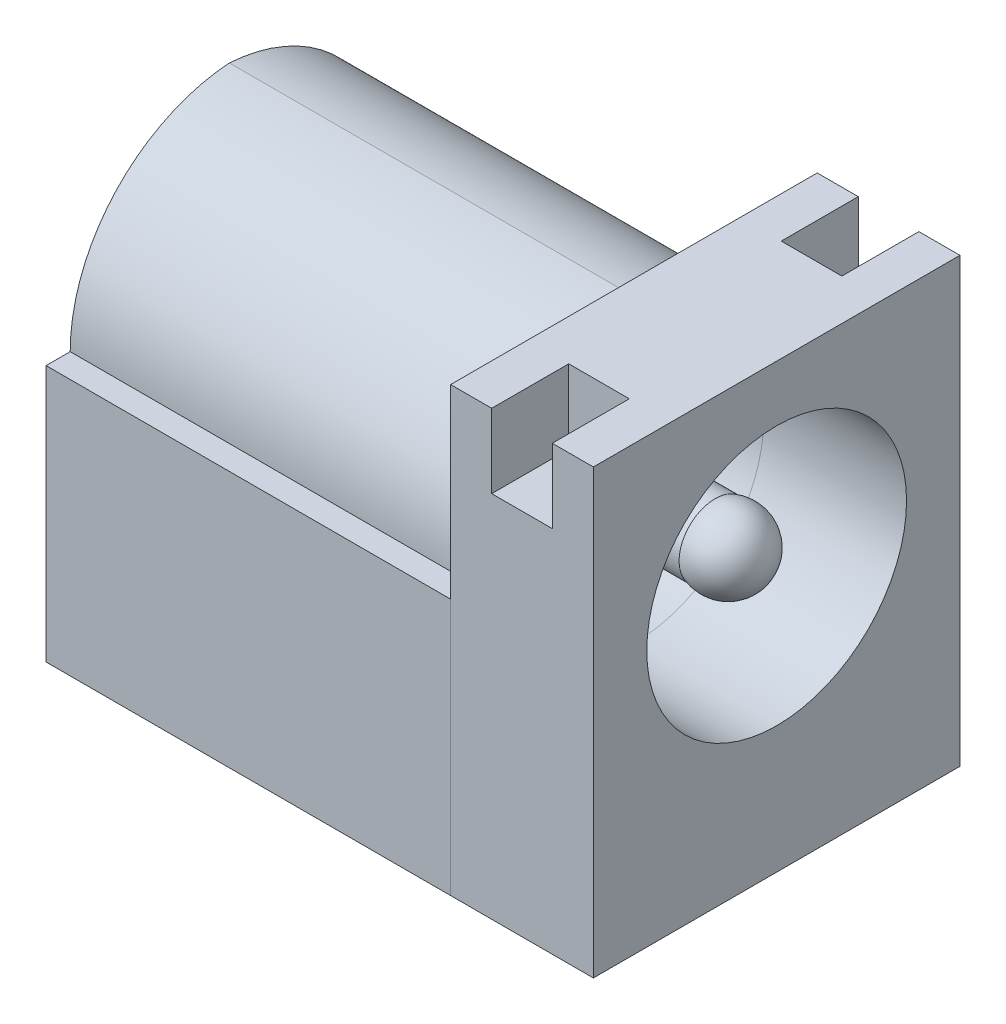
ISO-10303-21;
HEADER;
FILE_DESCRIPTION(('STEP AP214'),'2;1');
FILE_NAME('part.step','',(''),(''),'','','');
FILE_SCHEMA(('AUTOMOTIVE_DESIGN { 1 0 10303 214 1 1 1 1 }'));
ENDSEC;
DATA;
#1=APPLICATION_CONTEXT('core data for automotive mechanical design processes');
#2=APPLICATION_PROTOCOL_DEFINITION('international standard','automotive_design',2000,#1);
#3=PRODUCT_CONTEXT('',#1,'mechanical');
#4=PRODUCT('Part','Part','',(#3));
#5=PRODUCT_RELATED_PRODUCT_CATEGORY('part','',(#4));
#6=PRODUCT_DEFINITION_FORMATION('','',#4);
#7=PRODUCT_DEFINITION_CONTEXT('part definition',#1,'design');
#8=PRODUCT_DEFINITION('design','',#6,#7);
#9=PRODUCT_DEFINITION_SHAPE('','',#8);
#10=(LENGTH_UNIT() NAMED_UNIT(*) SI_UNIT(.MILLI.,.METRE.));
#11=(NAMED_UNIT(*) PLANE_ANGLE_UNIT() SI_UNIT($,.RADIAN.));
#12=(NAMED_UNIT(*) SI_UNIT($,.STERADIAN.) SOLID_ANGLE_UNIT());
#13=UNCERTAINTY_MEASURE_WITH_UNIT(LENGTH_MEASURE(1.E-05),#10,'distance_accuracy_value','');
#14=(GEOMETRIC_REPRESENTATION_CONTEXT(3) GLOBAL_UNCERTAINTY_ASSIGNED_CONTEXT((#13)) GLOBAL_UNIT_ASSIGNED_CONTEXT((#10,
#11,#12)) REPRESENTATION_CONTEXT('',''));
#15=CARTESIAN_POINT('',(0.,0.,0.));
#16=DIRECTION('',(0.,0.,1.));
#17=DIRECTION('',(1.,0.,0.));
#18=AXIS2_PLACEMENT_3D('',#15,#16,#17);
#19=CARTESIAN_POINT('',(-1.524,0.876299999999998,0.));
#20=DIRECTION('',(-1.,0.,0.));
#21=DIRECTION('',(0.,0.,1.));
#22=AXIS2_PLACEMENT_3D('',#19,#20,#21);
#23=CYLINDRICAL_SURFACE('',#22,0.889);
#24=CARTESIAN_POINT('',(-1.524,0.876299999999998,0.));
#25=DIRECTION('',(1.,0.,0.));
#26=DIRECTION('',(0.,0.,-1.));
#27=AXIS2_PLACEMENT_3D('',#24,#25,#26);
#28=CIRCLE('',#27,0.889);
#29=CARTESIAN_POINT('',(-1.524,0.876299999999998,-0.889));
#30=VERTEX_POINT('',#29);
#31=EDGE_CURVE('E11',#30,#30,#28,.T.);
#32=ORIENTED_EDGE('',*,*,#31,.F.);
#33=EDGE_LOOP('',(#32));
#34=FACE_BOUND('',#33,.T.);
#35=CARTESIAN_POINT('',(-9.0678,0.876299999999998,0.));
#36=DIRECTION('',(1.,0.,0.));
#37=DIRECTION('',(0.,0.,-1.));
#38=AXIS2_PLACEMENT_3D('',#35,#36,#37);
#39=CIRCLE('',#38,0.889);
#40=CARTESIAN_POINT('',(-9.0678,0.876299999999998,-0.889));
#41=VERTEX_POINT('',#40);
#42=EDGE_CURVE('E48',#41,#41,#39,.T.);
#43=ORIENTED_EDGE('',*,*,#42,.T.);
#44=EDGE_LOOP('',(#43));
#45=FACE_BOUND('',#44,.T.);
#46=ADVANCED_FACE('F41',(#34,#45),#23,.T.);
#47=CARTESIAN_POINT('',(-1.20015,0.876299999999998,0.));
#48=DIRECTION('',(0.,0.,1.));
#49=DIRECTION('',(1.,0.,0.));
#50=AXIS2_PLACEMENT_3D('',#47,#48,#49);
#51=SPHERICAL_SURFACE('',#50,0.94615);
#52=CARTESIAN_POINT('',(-1.20015,0.876299999999998,0.));
#53=DIRECTION('',(1.,0.,0.));
#54=DIRECTION('',(0.,0.,-1.));
#55=AXIS2_PLACEMENT_3D('',#52,#53,#54);
#56=SPHERICAL_SURFACE('',#55,0.94615);
#57=ORIENTED_EDGE('',*,*,#31,.T.);
#58=EDGE_LOOP('',(#57));
#59=FACE_BOUND('',#58,.T.);
#60=ADVANCED_FACE('F43',(#59),#56,.T.);
#61=CARTESIAN_POINT('',(-9.0678,0.876299999999998,0.));
#62=DIRECTION('',(1.,0.,0.));
#63=DIRECTION('',(0.,0.,-1.));
#64=AXIS2_PLACEMENT_3D('',#61,#62,#63);
#65=PLANE('',#64);
#66=ORIENTED_EDGE('',*,*,#42,.F.);
#67=EDGE_LOOP('',(#66));
#68=FACE_BOUND('',#67,.T.);
#69=ADVANCED_FACE('F55',(#68),#65,.F.);
#70=CLOSED_SHELL('',(#46,#60,#69));
#71=MANIFOLD_SOLID_BREP('B2',#70);
#72=CARTESIAN_POINT('',(-13.5382,-5.4737,-4.53389999999999));
#73=DIRECTION('',(0.,0.,1.));
#74=DIRECTION('',(0.,-1.,0.));
#75=AXIS2_PLACEMENT_3D('',#72,#73,#74);
#76=PLANE('',#75);
#77=DIRECTION('',(0.,-1.,0.));
#78=VECTOR('',#77,1.);
#79=CARTESIAN_POINT('',(-3.5306,-5.4737,-4.53389999999999));
#80=LINE('',#79,#78);
#81=CARTESIAN_POINT('',(-3.5306,0.876299999999998,-4.53389999999999));
#82=VERTEX_POINT('',#81);
#83=CARTESIAN_POINT('',(-3.5306,-5.4737,-4.53389999999999));
#84=VERTEX_POINT('',#83);
#85=EDGE_CURVE('E181',#82,#84,#80,.T.);
#86=ORIENTED_EDGE('',*,*,#85,.T.);
#87=DIRECTION('',(1.,0.,0.));
#88=VECTOR('',#87,1.);
#89=CARTESIAN_POINT('',(-13.5382,-5.4737,-4.53389999999999));
#90=LINE('',#89,#88);
#91=CARTESIAN_POINT('',(-13.5382,-5.4737,-4.53389999999999));
#92=VERTEX_POINT('',#91);
#93=EDGE_CURVE('E39',#92,#84,#90,.T.);
#94=ORIENTED_EDGE('',*,*,#93,.F.);
#95=DIRECTION('',(0.,-1.,0.));
#96=VECTOR('',#95,1.);
#97=CARTESIAN_POINT('',(-13.5382,-5.4737,-4.53389999999999));
#98=LINE('',#97,#96);
#99=CARTESIAN_POINT('',(-13.5382,0.876299999999998,-4.53389999999999));
#100=VERTEX_POINT('',#99);
#101=EDGE_CURVE('E193',#100,#92,#98,.T.);
#102=ORIENTED_EDGE('',*,*,#101,.F.);
#103=DIRECTION('',(1.,0.,0.));
#104=VECTOR('',#103,1.);
#105=CARTESIAN_POINT('',(-13.5382,0.876299999999998,-4.53389999999999));
#106=LINE('',#105,#104);
#107=EDGE_CURVE('E177',#100,#82,#106,.T.);
#108=ORIENTED_EDGE('',*,*,#107,.T.);
#109=EDGE_LOOP('',(#86,#94,#102,#108));
#110=FACE_BOUND('',#109,.T.);
#111=ADVANCED_FACE('F90',(#110),#76,.F.);
#112=CARTESIAN_POINT('',(-13.5382,-5.4737,-4.53389999999999));
#113=DIRECTION('',(0.,1.,0.));
#114=DIRECTION('',(0.,0.,1.));
#115=AXIS2_PLACEMENT_3D('',#112,#113,#114);
#116=PLANE('',#115);
#117=DIRECTION('',(0.,0.,1.));
#118=VECTOR('',#117,1.);
#119=CARTESIAN_POINT('',(-3.5306,-5.4737,-4.53389999999999));
#120=LINE('',#119,#118);
#121=CARTESIAN_POINT('',(-3.5306,-5.4737,4.53390000000001));
#122=VERTEX_POINT('',#121);
#123=EDGE_CURVE('E184',#84,#122,#120,.T.);
#124=ORIENTED_EDGE('',*,*,#123,.T.);
#125=DIRECTION('',(1.,0.,0.));
#126=VECTOR('',#125,1.);
#127=CARTESIAN_POINT('',(-13.5382,-5.4737,4.53390000000001));
#128=LINE('',#127,#126);
#129=CARTESIAN_POINT('',(-13.5382,-5.4737,4.53390000000001));
#130=VERTEX_POINT('',#129);
#131=EDGE_CURVE('E99',#130,#122,#128,.T.);
#132=ORIENTED_EDGE('',*,*,#131,.F.);
#133=DIRECTION('',(0.,0.,1.));
#134=VECTOR('',#133,1.);
#135=CARTESIAN_POINT('',(-13.5382,-5.4737,-4.53389999999999));
#136=LINE('',#135,#134);
#137=EDGE_CURVE('E147',#92,#130,#136,.T.);
#138=ORIENTED_EDGE('',*,*,#137,.F.);
#139=ORIENTED_EDGE('',*,*,#93,.T.);
#140=EDGE_LOOP('',(#124,#132,#138,#139));
#141=FACE_BOUND('',#140,.T.);
#142=ADVANCED_FACE('F239',(#141),#116,.F.);
#143=CARTESIAN_POINT('',(-13.5382,-5.4737,4.53390000000001));
#144=DIRECTION('',(0.,0.,-1.));
#145=DIRECTION('',(-1.,0.,0.));
#146=AXIS2_PLACEMENT_3D('',#143,#144,#145);
#147=PLANE('',#146);
#148=DIRECTION('',(0.,1.,0.));
#149=VECTOR('',#148,1.);
#150=CARTESIAN_POINT('',(-3.5306,-5.4737,4.53390000000001));
#151=LINE('',#150,#149);
#152=CARTESIAN_POINT('',(-3.5306,0.876299999999999,4.53390000000001));
#153=VERTEX_POINT('',#152);
#154=EDGE_CURVE('E186',#122,#153,#151,.T.);
#155=ORIENTED_EDGE('',*,*,#154,.T.);
#156=DIRECTION('',(1.,0.,0.));
#157=VECTOR('',#156,1.);
#158=CARTESIAN_POINT('',(-13.5382,0.876299999999999,4.53390000000001));
#159=LINE('',#158,#157);
#160=CARTESIAN_POINT('',(-13.5382,0.876299999999999,4.53390000000001));
#161=VERTEX_POINT('',#160);
#162=EDGE_CURVE('E197',#161,#153,#159,.T.);
#163=ORIENTED_EDGE('',*,*,#162,.F.);
#164=DIRECTION('',(0.,1.,0.));
#165=VECTOR('',#164,1.);
#166=CARTESIAN_POINT('',(-13.5382,-5.4737,4.53390000000001));
#167=LINE('',#166,#165);
#168=EDGE_CURVE('E206',#130,#161,#167,.T.);
#169=ORIENTED_EDGE('',*,*,#168,.F.);
#170=ORIENTED_EDGE('',*,*,#131,.T.);
#171=EDGE_LOOP('',(#155,#163,#169,#170));
#172=FACE_BOUND('',#171,.T.);
#173=ADVANCED_FACE('F204',(#172),#147,.F.);
#174=CARTESIAN_POINT('',(-13.5382,0.876299999999998,3.937));
#175=DIRECTION('',(0.,-1.,0.));
#176=DIRECTION('',(0.,0.,-1.));
#177=AXIS2_PLACEMENT_3D('',#174,#175,#176);
#178=PLANE('',#177);
#179=DIRECTION('',(0.,0.,-1.));
#180=VECTOR('',#179,1.);
#181=CARTESIAN_POINT('',(-3.5306,0.876299999999998,3.937));
#182=LINE('',#181,#180);
#183=CARTESIAN_POINT('',(-3.5306,0.876299999999998,3.937));
#184=VERTEX_POINT('',#183);
#185=EDGE_CURVE('E188',#153,#184,#182,.T.);
#186=ORIENTED_EDGE('',*,*,#185,.T.);
#187=DIRECTION('',(1.,0.,0.));
#188=VECTOR('',#187,1.);
#189=CARTESIAN_POINT('',(-13.5382,0.876299999999998,3.937));
#190=LINE('',#189,#188);
#191=CARTESIAN_POINT('',(-13.5382,0.876299999999998,3.937));
#192=VERTEX_POINT('',#191);
#193=EDGE_CURVE('E172',#192,#184,#190,.T.);
#194=ORIENTED_EDGE('',*,*,#193,.F.);
#195=DIRECTION('',(0.,0.,-1.));
#196=VECTOR('',#195,1.);
#197=CARTESIAN_POINT('',(-13.5382,0.876299999999998,3.937));
#198=LINE('',#197,#196);
#199=EDGE_CURVE('E163',#161,#192,#198,.T.);
#200=ORIENTED_EDGE('',*,*,#199,.F.);
#201=ORIENTED_EDGE('',*,*,#162,.T.);
#202=EDGE_LOOP('',(#186,#194,#200,#201));
#203=FACE_BOUND('',#202,.T.);
#204=ADVANCED_FACE('F212',(#203),#178,.F.);
#205=CARTESIAN_POINT('',(-13.5382,0.876299999999994,-0.289314193548392));
#206=DIRECTION('',(1.,0.,0.));
#207=DIRECTION('',(0.,0.,-1.));
#208=AXIS2_PLACEMENT_3D('',#205,#206,#207);
#209=CYLINDRICAL_SURFACE('',#208,4.22631419354839);
#210=CARTESIAN_POINT('',(-3.5306,0.876299999999994,-0.289314193548392));
#211=DIRECTION('',(-1.,0.,0.));
#212=DIRECTION('',(0.,0.,1.));
#213=AXIS2_PLACEMENT_3D('',#210,#211,#212);
#214=CIRCLE('',#213,4.22631419354839);
#215=CARTESIAN_POINT('',(-3.5306,5.0927,0.));
#216=VERTEX_POINT('',#215);
#217=EDGE_CURVE('E171',#184,#216,#214,.T.);
#218=ORIENTED_EDGE('',*,*,#217,.T.);
#219=DIRECTION('',(1.,0.,0.));
#220=VECTOR('',#219,1.);
#221=CARTESIAN_POINT('',(-13.5382,5.0927,0.));
#222=LINE('',#221,#220);
#223=CARTESIAN_POINT('',(-13.5382,5.0927,0.));
#224=VERTEX_POINT('',#223);
#225=EDGE_CURVE('E168',#224,#216,#222,.T.);
#226=ORIENTED_EDGE('',*,*,#225,.F.);
#227=CARTESIAN_POINT('',(-13.5382,0.876299999999994,-0.289314193548392));
#228=DIRECTION('',(-1.,0.,0.));
#229=DIRECTION('',(0.,0.,1.));
#230=AXIS2_PLACEMENT_3D('',#227,#228,#229);
#231=CIRCLE('',#230,4.22631419354839);
#232=EDGE_CURVE('E157',#192,#224,#231,.T.);
#233=ORIENTED_EDGE('',*,*,#232,.F.);
#234=ORIENTED_EDGE('',*,*,#193,.T.);
#235=EDGE_LOOP('',(#218,#226,#233,#234));
#236=FACE_BOUND('',#235,.T.);
#237=ADVANCED_FACE('F169',(#236),#209,.T.);
#238=CARTESIAN_POINT('',(-13.5382,0.876299999999998,0.289314193548387));
#239=DIRECTION('',(1.,0.,0.));
#240=DIRECTION('',(0.,0.,-1.));
#241=AXIS2_PLACEMENT_3D('',#238,#239,#240);
#242=CYLINDRICAL_SURFACE('',#241,4.22631419354839);
#243=CARTESIAN_POINT('',(-3.5306,0.876299999999998,0.289314193548387));
#244=DIRECTION('',(-1.,0.,0.));
#245=DIRECTION('',(0.,0.,-1.));
#246=AXIS2_PLACEMENT_3D('',#243,#244,#245);
#247=CIRCLE('',#246,4.22631419354839);
#248=CARTESIAN_POINT('',(-3.5306,0.876299999999998,-3.937));
#249=VERTEX_POINT('',#248);
#250=EDGE_CURVE('E133',#216,#249,#247,.T.);
#251=ORIENTED_EDGE('',*,*,#250,.T.);
#252=DIRECTION('',(1.,0.,0.));
#253=VECTOR('',#252,1.);
#254=CARTESIAN_POINT('',(-13.5382,0.876299999999998,-3.937));
#255=LINE('',#254,#253);
#256=CARTESIAN_POINT('',(-13.5382,0.876299999999998,-3.937));
#257=VERTEX_POINT('',#256);
#258=EDGE_CURVE('E173',#257,#249,#255,.T.);
#259=ORIENTED_EDGE('',*,*,#258,.F.);
#260=CARTESIAN_POINT('',(-13.5382,0.876299999999998,0.289314193548387));
#261=DIRECTION('',(-1.,0.,0.));
#262=DIRECTION('',(0.,0.,-1.));
#263=AXIS2_PLACEMENT_3D('',#260,#261,#262);
#264=CIRCLE('',#263,4.22631419354839);
#265=EDGE_CURVE('E161',#224,#257,#264,.T.);
#266=ORIENTED_EDGE('',*,*,#265,.F.);
#267=ORIENTED_EDGE('',*,*,#225,.T.);
#268=EDGE_LOOP('',(#251,#259,#266,#267));
#269=FACE_BOUND('',#268,.T.);
#270=ADVANCED_FACE('F175',(#269),#242,.T.);
#271=CARTESIAN_POINT('',(-13.5382,0.876299999999998,-4.53389999999999));
#272=DIRECTION('',(0.,-1.,0.));
#273=DIRECTION('',(0.,0.,-1.));
#274=AXIS2_PLACEMENT_3D('',#271,#272,#273);
#275=PLANE('',#274);
#276=DIRECTION('',(0.,0.,-1.));
#277=VECTOR('',#276,1.);
#278=CARTESIAN_POINT('',(-3.5306,0.876299999999998,-4.53389999999999));
#279=LINE('',#278,#277);
#280=EDGE_CURVE('E139',#249,#82,#279,.T.);
#281=ORIENTED_EDGE('',*,*,#280,.T.);
#282=ORIENTED_EDGE('',*,*,#107,.F.);
#283=DIRECTION('',(0.,0.,-1.));
#284=VECTOR('',#283,1.);
#285=CARTESIAN_POINT('',(-13.5382,0.876299999999998,-4.53389999999999));
#286=LINE('',#285,#284);
#287=EDGE_CURVE('E107',#257,#100,#286,.T.);
#288=ORIENTED_EDGE('',*,*,#287,.F.);
#289=ORIENTED_EDGE('',*,*,#258,.T.);
#290=EDGE_LOOP('',(#281,#282,#288,#289));
#291=FACE_BOUND('',#290,.T.);
#292=ADVANCED_FACE('F235',(#291),#275,.F.);
#293=CARTESIAN_POINT('',(-13.5382,0.876299999999998,0.289314193548387));
#294=DIRECTION('',(1.,0.,0.));
#295=DIRECTION('',(0.,0.,-1.));
#296=AXIS2_PLACEMENT_3D('',#293,#294,#295);
#297=PLANE('',#296);
#298=ORIENTED_EDGE('',*,*,#101,.T.);
#299=ORIENTED_EDGE('',*,*,#137,.T.);
#300=ORIENTED_EDGE('',*,*,#168,.T.);
#301=ORIENTED_EDGE('',*,*,#199,.T.);
#302=ORIENTED_EDGE('',*,*,#232,.T.);
#303=ORIENTED_EDGE('',*,*,#265,.T.);
#304=ORIENTED_EDGE('',*,*,#287,.T.);
#305=EDGE_LOOP('',(#298,#299,#300,#301,#302,#303,#304));
#306=FACE_BOUND('',#305,.T.);
#307=ADVANCED_FACE('F159',(#306),#297,.F.);
#308=CARTESIAN_POINT('',(-3.5306,0.876299999999998,0.289314193548387));
#309=DIRECTION('',(1.,0.,0.));
#310=DIRECTION('',(0.,0.,-1.));
#311=AXIS2_PLACEMENT_3D('',#308,#309,#310);
#312=PLANE('',#311);
#313=CARTESIAN_POINT('',(-3.5306,0.876299999999998,0.));
#314=DIRECTION('',(1.,0.,0.));
#315=DIRECTION('',(0.,0.,-1.));
#316=AXIS2_PLACEMENT_3D('',#313,#314,#315);
#317=CIRCLE('',#316,3.2131);
#318=CARTESIAN_POINT('',(-3.5306,0.876299999999998,-3.2131));
#319=VERTEX_POINT('',#318);
#320=EDGE_CURVE('E93',#319,#319,#317,.T.);
#321=ORIENTED_EDGE('',*,*,#320,.F.);
#322=EDGE_LOOP('',(#321));
#323=FACE_BOUND('',#322,.T.);
#324=ORIENTED_EDGE('',*,*,#85,.F.);
#325=ORIENTED_EDGE('',*,*,#280,.F.);
#326=ORIENTED_EDGE('',*,*,#250,.F.);
#327=ORIENTED_EDGE('',*,*,#217,.F.);
#328=ORIENTED_EDGE('',*,*,#185,.F.);
#329=ORIENTED_EDGE('',*,*,#154,.F.);
#330=ORIENTED_EDGE('',*,*,#123,.F.);
#331=EDGE_LOOP('',(#324,#325,#326,#327,#328,#329,#330));
#332=FACE_BOUND('',#331,.T.);
#333=ADVANCED_FACE('F210',(#323,#332),#312,.T.);
#334=CARTESIAN_POINT('',(-9.0678,0.876299999999998,0.));
#335=DIRECTION('',(1.,0.,0.));
#336=DIRECTION('',(0.,0.,-1.));
#337=AXIS2_PLACEMENT_3D('',#334,#335,#336);
#338=CYLINDRICAL_SURFACE('',#337,3.2131);
#339=ORIENTED_EDGE('',*,*,#320,.T.);
#340=EDGE_LOOP('',(#339));
#341=FACE_BOUND('',#340,.T.);
#342=CARTESIAN_POINT('',(-9.0678,0.876299999999998,0.));
#343=DIRECTION('',(1.,0.,0.));
#344=DIRECTION('',(0.,0.,-1.));
#345=AXIS2_PLACEMENT_3D('',#342,#343,#344);
#346=CIRCLE('',#345,3.2131);
#347=CARTESIAN_POINT('',(-9.0678,0.876299999999998,-3.2131));
#348=VERTEX_POINT('',#347);
#349=EDGE_CURVE('E217',#348,#348,#346,.T.);
#350=ORIENTED_EDGE('',*,*,#349,.F.);
#351=EDGE_LOOP('',(#350));
#352=FACE_BOUND('',#351,.T.);
#353=ADVANCED_FACE('F224',(#341,#352),#338,.F.);
#354=CARTESIAN_POINT('',(-9.0678,0.876299999999998,0.));
#355=DIRECTION('',(1.,0.,0.));
#356=DIRECTION('',(0.,0.,-1.));
#357=AXIS2_PLACEMENT_3D('',#354,#355,#356);
#358=PLANE('',#357);
#359=ORIENTED_EDGE('',*,*,#349,.T.);
#360=EDGE_LOOP('',(#359));
#361=FACE_BOUND('',#360,.T.);
#362=ADVANCED_FACE('F233',(#361),#358,.T.);
#363=CLOSED_SHELL('',(#111,#142,#173,#204,#237,#270,#292,#307,#333,#353,#362));
#364=MANIFOLD_SOLID_BREP('B6',#363);
#365=CARTESIAN_POINT('',(-3.5306,-5.4737,-4.53389999999999));
#366=DIRECTION('',(0.,0.,-1.));
#367=DIRECTION('',(-1.,0.,0.));
#368=AXIS2_PLACEMENT_3D('',#365,#366,#367);
#369=PLANE('',#368);
#370=DIRECTION('',(0.,1.,0.));
#371=VECTOR('',#370,1.);
#372=CARTESIAN_POINT('',(-2.5146,-5.4737,-4.53389999999999));
#373=LINE('',#372,#371);
#374=CARTESIAN_POINT('',(-2.5146,3.6449,-4.53389999999999));
#375=VERTEX_POINT('',#374);
#376=CARTESIAN_POINT('',(-2.5146,5.4737,-4.53389999999999));
#377=VERTEX_POINT('',#376);
#378=EDGE_CURVE('E437',#375,#377,#373,.T.);
#379=ORIENTED_EDGE('',*,*,#378,.F.);
#380=DIRECTION('',(1.,0.,0.));
#381=VECTOR('',#380,1.);
#382=CARTESIAN_POINT('',(-3.5306,3.6449,-4.53389999999999));
#383=LINE('',#382,#381);
#384=CARTESIAN_POINT('',(-1.016,3.6449,-4.53389999999999));
#385=VERTEX_POINT('',#384);
#386=EDGE_CURVE('E88',#375,#385,#383,.T.);
#387=ORIENTED_EDGE('',*,*,#386,.T.);
#388=DIRECTION('',(0.,-1.,0.));
#389=VECTOR('',#388,1.);
#390=CARTESIAN_POINT('',(-1.016,-5.4737,-4.53389999999999));
#391=LINE('',#390,#389);
#392=CARTESIAN_POINT('',(-1.016,5.4737,-4.53389999999999));
#393=VERTEX_POINT('',#392);
#394=EDGE_CURVE('E423',#393,#385,#391,.T.);
#395=ORIENTED_EDGE('',*,*,#394,.F.);
#396=DIRECTION('',(1.,0.,0.));
#397=VECTOR('',#396,1.);
#398=CARTESIAN_POINT('',(-3.5306,5.4737,-4.53389999999999));
#399=LINE('',#398,#397);
#400=CARTESIAN_POINT('',(0.,5.4737,-4.53389999999999));
#401=VERTEX_POINT('',#400);
#402=EDGE_CURVE('E480',#393,#401,#399,.T.);
#403=ORIENTED_EDGE('',*,*,#402,.T.);
#404=DIRECTION('',(0.,1.,0.));
#405=VECTOR('',#404,1.);
#406=CARTESIAN_POINT('',(0.,-5.4737,-4.53389999999999));
#407=LINE('',#406,#405);
#408=CARTESIAN_POINT('',(0.,-5.4737,-4.53389999999999));
#409=VERTEX_POINT('',#408);
#410=EDGE_CURVE('E466',#409,#401,#407,.T.);
#411=ORIENTED_EDGE('',*,*,#410,.F.);
#412=DIRECTION('',(1.,0.,0.));
#413=VECTOR('',#412,1.);
#414=CARTESIAN_POINT('',(-3.5306,-5.4737,-4.53389999999999));
#415=LINE('',#414,#413);
#416=CARTESIAN_POINT('',(-3.5306,-5.4737,-4.53389999999999));
#417=VERTEX_POINT('',#416);
#418=EDGE_CURVE('E491',#417,#409,#415,.T.);
#419=ORIENTED_EDGE('',*,*,#418,.F.);
#420=DIRECTION('',(0.,1.,0.));
#421=VECTOR('',#420,1.);
#422=CARTESIAN_POINT('',(-3.5306,-5.4737,-4.53389999999999));
#423=LINE('',#422,#421);
#424=CARTESIAN_POINT('',(-3.5306,5.4737,-4.53389999999999));
#425=VERTEX_POINT('',#424);
#426=EDGE_CURVE('E467',#417,#425,#423,.T.);
#427=ORIENTED_EDGE('',*,*,#426,.T.);
#428=EDGE_CURVE('E500',#425,#377,#399,.T.);
#429=ORIENTED_EDGE('',*,*,#428,.T.);
#430=EDGE_LOOP('',(#379,#387,#395,#403,#411,#419,#427,#429));
#431=FACE_BOUND('',#430,.T.);
#432=ADVANCED_FACE('F321',(#431),#369,.T.);
#433=CARTESIAN_POINT('',(-3.5306,-5.4737,4.53390000000001));
#434=DIRECTION('',(0.,-1.,0.));
#435=DIRECTION('',(0.,0.,-1.));
#436=AXIS2_PLACEMENT_3D('',#433,#434,#435);
#437=PLANE('',#436);
#438=DIRECTION('',(0.,0.,-1.));
#439=VECTOR('',#438,1.);
#440=CARTESIAN_POINT('',(0.,-5.4737,4.53390000000001));
#441=LINE('',#440,#439);
#442=CARTESIAN_POINT('',(0.,-5.4737,4.53390000000001));
#443=VERTEX_POINT('',#442);
#444=EDGE_CURVE('E471',#443,#409,#441,.T.);
#445=ORIENTED_EDGE('',*,*,#444,.F.);
#446=DIRECTION('',(1.,0.,0.));
#447=VECTOR('',#446,1.);
#448=CARTESIAN_POINT('',(-3.5306,-5.4737,4.53390000000001));
#449=LINE('',#448,#447);
#450=CARTESIAN_POINT('',(-3.5306,-5.4737,4.53390000000001));
#451=VERTEX_POINT('',#450);
#452=EDGE_CURVE('E494',#451,#443,#449,.T.);
#453=ORIENTED_EDGE('',*,*,#452,.F.);
#454=DIRECTION('',(0.,0.,-1.));
#455=VECTOR('',#454,1.);
#456=CARTESIAN_POINT('',(-3.5306,-5.4737,4.53390000000001));
#457=LINE('',#456,#455);
#458=EDGE_CURVE('E477',#451,#417,#457,.T.);
#459=ORIENTED_EDGE('',*,*,#458,.T.);
#460=ORIENTED_EDGE('',*,*,#418,.T.);
#461=EDGE_LOOP('',(#445,#453,#459,#460));
#462=FACE_BOUND('',#461,.T.);
#463=ADVANCED_FACE('F541',(#462),#437,.T.);
#464=CARTESIAN_POINT('',(-3.5306,-5.4737,4.53390000000001));
#465=DIRECTION('',(0.,0.,1.));
#466=DIRECTION('',(1.,0.,0.));
#467=AXIS2_PLACEMENT_3D('',#464,#465,#466);
#468=PLANE('',#467);
#469=DIRECTION('',(0.,-1.,0.));
#470=VECTOR('',#469,1.);
#471=CARTESIAN_POINT('',(-2.5146,-5.4737,4.53390000000001));
#472=LINE('',#471,#470);
#473=CARTESIAN_POINT('',(-2.5146,5.4737,4.53390000000001));
#474=VERTEX_POINT('',#473);
#475=CARTESIAN_POINT('',(-2.5146,3.6449,4.53390000000001));
#476=VERTEX_POINT('',#475);
#477=EDGE_CURVE('E458',#474,#476,#472,.T.);
#478=ORIENTED_EDGE('',*,*,#477,.F.);
#479=DIRECTION('',(1.,0.,0.));
#480=VECTOR('',#479,1.);
#481=CARTESIAN_POINT('',(-3.5306,5.4737,4.53390000000001));
#482=LINE('',#481,#480);
#483=CARTESIAN_POINT('',(-3.5306,5.4737,4.53390000000001));
#484=VERTEX_POINT('',#483);
#485=EDGE_CURVE('E496',#484,#474,#482,.T.);
#486=ORIENTED_EDGE('',*,*,#485,.F.);
#487=DIRECTION('',(0.,-1.,0.));
#488=VECTOR('',#487,1.);
#489=CARTESIAN_POINT('',(-3.5306,-5.4737,4.53390000000001));
#490=LINE('',#489,#488);
#491=EDGE_CURVE('E474',#484,#451,#490,.T.);
#492=ORIENTED_EDGE('',*,*,#491,.T.);
#493=ORIENTED_EDGE('',*,*,#452,.T.);
#494=DIRECTION('',(0.,-1.,0.));
#495=VECTOR('',#494,1.);
#496=CARTESIAN_POINT('',(0.,-5.4737,4.53390000000001));
#497=LINE('',#496,#495);
#498=CARTESIAN_POINT('',(0.,5.4737,4.53390000000001));
#499=VERTEX_POINT('',#498);
#500=EDGE_CURVE('E486',#499,#443,#497,.T.);
#501=ORIENTED_EDGE('',*,*,#500,.F.);
#502=CARTESIAN_POINT('',(-1.016,5.4737,4.53390000000001));
#503=VERTEX_POINT('',#502);
#504=EDGE_CURVE('E499',#503,#499,#482,.T.);
#505=ORIENTED_EDGE('',*,*,#504,.F.);
#506=DIRECTION('',(0.,1.,0.));
#507=VECTOR('',#506,1.);
#508=CARTESIAN_POINT('',(-1.016,-5.4737,4.53390000000001));
#509=LINE('',#508,#507);
#510=CARTESIAN_POINT('',(-1.016,3.6449,4.53390000000001));
#511=VERTEX_POINT('',#510);
#512=EDGE_CURVE('E343',#511,#503,#509,.T.);
#513=ORIENTED_EDGE('',*,*,#512,.F.);
#514=DIRECTION('',(-1.,0.,0.));
#515=VECTOR('',#514,1.);
#516=CARTESIAN_POINT('',(-3.5306,3.6449,4.53390000000001));
#517=LINE('',#516,#515);
#518=EDGE_CURVE('E504',#511,#476,#517,.T.);
#519=ORIENTED_EDGE('',*,*,#518,.T.);
#520=EDGE_LOOP('',(#478,#486,#492,#493,#501,#505,#513,#519));
#521=FACE_BOUND('',#520,.T.);
#522=ADVANCED_FACE('F524',(#521),#468,.T.);
#523=CARTESIAN_POINT('',(-3.5306,5.4737,4.53390000000001));
#524=DIRECTION('',(0.,1.,0.));
#525=DIRECTION('',(0.,0.,1.));
#526=AXIS2_PLACEMENT_3D('',#523,#524,#525);
#527=PLANE('',#526);
#528=DIRECTION('',(0.,0.,1.));
#529=VECTOR('',#528,1.);
#530=CARTESIAN_POINT('',(-2.5146,5.4737,4.53390000000001));
#531=LINE('',#530,#529);
#532=CARTESIAN_POINT('',(-2.5146,5.4737,-2.62890000000001));
#533=VERTEX_POINT('',#532);
#534=EDGE_CURVE('E328',#377,#533,#531,.T.);
#535=ORIENTED_EDGE('',*,*,#534,.F.);
#536=ORIENTED_EDGE('',*,*,#428,.F.);
#537=DIRECTION('',(0.,0.,1.));
#538=VECTOR('',#537,1.);
#539=CARTESIAN_POINT('',(-3.5306,5.4737,4.53390000000001));
#540=LINE('',#539,#538);
#541=EDGE_CURVE('E470',#425,#484,#540,.T.);
#542=ORIENTED_EDGE('',*,*,#541,.T.);
#543=ORIENTED_EDGE('',*,*,#485,.T.);
#544=DIRECTION('',(0.,0.,1.));
#545=VECTOR('',#544,1.);
#546=CARTESIAN_POINT('',(-2.5146,5.4737,2.62890000000001));
#547=LINE('',#546,#545);
#548=CARTESIAN_POINT('',(-2.5146,5.4737,2.62890000000001));
#549=VERTEX_POINT('',#548);
#550=EDGE_CURVE('E439',#549,#474,#547,.T.);
#551=ORIENTED_EDGE('',*,*,#550,.F.);
#552=DIRECTION('',(-1.,0.,0.));
#553=VECTOR('',#552,1.);
#554=CARTESIAN_POINT('',(-2.5146,5.4737,2.62890000000001));
#555=LINE('',#554,#553);
#556=CARTESIAN_POINT('',(-1.016,5.4737,2.62890000000001));
#557=VERTEX_POINT('',#556);
#558=EDGE_CURVE('E444',#557,#549,#555,.T.);
#559=ORIENTED_EDGE('',*,*,#558,.F.);
#560=DIRECTION('',(0.,0.,-1.));
#561=VECTOR('',#560,1.);
#562=CARTESIAN_POINT('',(-1.016,5.4737,4.53390000000001));
#563=LINE('',#562,#561);
#564=EDGE_CURVE('E493',#503,#557,#563,.T.);
#565=ORIENTED_EDGE('',*,*,#564,.F.);
#566=ORIENTED_EDGE('',*,*,#504,.T.);
#567=DIRECTION('',(0.,0.,1.));
#568=VECTOR('',#567,1.);
#569=CARTESIAN_POINT('',(0.,5.4737,4.53390000000001));
#570=LINE('',#569,#568);
#571=EDGE_CURVE('E483',#401,#499,#570,.T.);
#572=ORIENTED_EDGE('',*,*,#571,.F.);
#573=ORIENTED_EDGE('',*,*,#402,.F.);
#574=DIRECTION('',(0.,0.,-1.));
#575=VECTOR('',#574,1.);
#576=CARTESIAN_POINT('',(-1.016,5.4737,-2.62890000000001));
#577=LINE('',#576,#575);
#578=CARTESIAN_POINT('',(-1.016,5.4737,-2.62890000000001));
#579=VERTEX_POINT('',#578);
#580=EDGE_CURVE('E429',#579,#393,#577,.T.);
#581=ORIENTED_EDGE('',*,*,#580,.F.);
#582=DIRECTION('',(1.,0.,0.));
#583=VECTOR('',#582,1.);
#584=CARTESIAN_POINT('',(-2.5146,5.4737,-2.62890000000001));
#585=LINE('',#584,#583);
#586=EDGE_CURVE('E335',#533,#579,#585,.T.);
#587=ORIENTED_EDGE('',*,*,#586,.F.);
#588=EDGE_LOOP('',(#535,#536,#542,#543,#551,#559,#565,#566,#572,#573,#581,#587));
#589=FACE_BOUND('',#588,.T.);
#590=ADVANCED_FACE('F511',(#589),#527,.T.);
#591=CARTESIAN_POINT('',(-3.5306,5.4737,-4.53389999999999));
#592=DIRECTION('',(-1.,0.,0.));
#593=DIRECTION('',(0.,0.,1.));
#594=AXIS2_PLACEMENT_3D('',#591,#592,#593);
#595=PLANE('',#594);
#596=CARTESIAN_POINT('',(-3.5306,0.876299999999998,0.));
#597=DIRECTION('',(-1.,0.,0.));
#598=DIRECTION('',(0.,0.,1.));
#599=AXIS2_PLACEMENT_3D('',#596,#597,#598);
#600=CIRCLE('',#599,3.2131);
#601=CARTESIAN_POINT('',(-3.5306,0.876299999999998,3.2131));
#602=VERTEX_POINT('',#601);
#603=EDGE_CURVE('E463',#602,#602,#600,.T.);
#604=ORIENTED_EDGE('',*,*,#603,.F.);
#605=EDGE_LOOP('',(#604));
#606=FACE_BOUND('',#605,.T.);
#607=ORIENTED_EDGE('',*,*,#426,.F.);
#608=ORIENTED_EDGE('',*,*,#458,.F.);
#609=ORIENTED_EDGE('',*,*,#491,.F.);
#610=ORIENTED_EDGE('',*,*,#541,.F.);
#611=EDGE_LOOP('',(#607,#608,#609,#610));
#612=FACE_BOUND('',#611,.T.);
#613=ADVANCED_FACE('F520',(#606,#612),#595,.T.);
#614=CARTESIAN_POINT('',(0.,5.4737,-4.53389999999999));
#615=DIRECTION('',(-1.,0.,0.));
#616=DIRECTION('',(0.,0.,1.));
#617=AXIS2_PLACEMENT_3D('',#614,#615,#616);
#618=PLANE('',#617);
#619=CARTESIAN_POINT('',(0.,0.876299999999998,0.));
#620=DIRECTION('',(1.,0.,0.));
#621=DIRECTION('',(0.,0.,-1.));
#622=AXIS2_PLACEMENT_3D('',#619,#620,#621);
#623=CIRCLE('',#622,3.2131);
#624=CARTESIAN_POINT('',(0.,0.876299999999998,-3.2131));
#625=VERTEX_POINT('',#624);
#626=EDGE_CURVE('E460',#625,#625,#623,.T.);
#627=ORIENTED_EDGE('',*,*,#626,.F.);
#628=EDGE_LOOP('',(#627));
#629=FACE_BOUND('',#628,.T.);
#630=ORIENTED_EDGE('',*,*,#410,.T.);
#631=ORIENTED_EDGE('',*,*,#571,.T.);
#632=ORIENTED_EDGE('',*,*,#500,.T.);
#633=ORIENTED_EDGE('',*,*,#444,.T.);
#634=EDGE_LOOP('',(#630,#631,#632,#633));
#635=FACE_BOUND('',#634,.T.);
#636=ADVANCED_FACE('F539',(#629,#635),#618,.F.);
#637=CARTESIAN_POINT('',(-9.0678,0.876299999999998,0.));
#638=DIRECTION('',(1.,0.,0.));
#639=DIRECTION('',(0.,0.,-1.));
#640=AXIS2_PLACEMENT_3D('',#637,#638,#639);
#641=CYLINDRICAL_SURFACE('',#640,3.2131);
#642=ORIENTED_EDGE('',*,*,#603,.T.);
#643=EDGE_LOOP('',(#642));
#644=FACE_BOUND('',#643,.T.);
#645=ORIENTED_EDGE('',*,*,#626,.T.);
#646=EDGE_LOOP('',(#645));
#647=FACE_BOUND('',#646,.T.);
#648=ADVANCED_FACE('F559',(#644,#647),#641,.F.);
#649=CARTESIAN_POINT('',(-2.5146,3.6449,2.62890000000001));
#650=DIRECTION('',(-1.,0.,0.));
#651=DIRECTION('',(0.,0.,1.));
#652=AXIS2_PLACEMENT_3D('',#649,#650,#651);
#653=PLANE('',#652);
#654=ORIENTED_EDGE('',*,*,#477,.T.);
#655=DIRECTION('',(0.,0.,1.));
#656=VECTOR('',#655,1.);
#657=CARTESIAN_POINT('',(-2.5146,3.6449,2.62890000000001));
#658=LINE('',#657,#656);
#659=CARTESIAN_POINT('',(-2.5146,3.6449,2.62890000000001));
#660=VERTEX_POINT('',#659);
#661=EDGE_CURVE('E440',#660,#476,#658,.T.);
#662=ORIENTED_EDGE('',*,*,#661,.F.);
#663=DIRECTION('',(0.,1.,0.));
#664=VECTOR('',#663,1.);
#665=CARTESIAN_POINT('',(-2.5146,3.6449,2.62890000000001));
#666=LINE('',#665,#664);
#667=EDGE_CURVE('E453',#660,#549,#666,.T.);
#668=ORIENTED_EDGE('',*,*,#667,.T.);
#669=ORIENTED_EDGE('',*,*,#550,.T.);
#670=EDGE_LOOP('',(#654,#662,#668,#669));
#671=FACE_BOUND('',#670,.T.);
#672=ADVANCED_FACE('F529',(#671),#653,.F.);
#673=CARTESIAN_POINT('',(-2.5146,3.6449,2.62890000000001));
#674=DIRECTION('',(0.,0.,-1.));
#675=DIRECTION('',(-1.,0.,0.));
#676=AXIS2_PLACEMENT_3D('',#673,#674,#675);
#677=PLANE('',#676);
#678=ORIENTED_EDGE('',*,*,#558,.T.);
#679=ORIENTED_EDGE('',*,*,#667,.F.);
#680=DIRECTION('',(-1.,0.,0.));
#681=VECTOR('',#680,1.);
#682=CARTESIAN_POINT('',(-2.5146,3.6449,2.62890000000001));
#683=LINE('',#682,#681);
#684=CARTESIAN_POINT('',(-1.016,3.6449,2.62890000000001));
#685=VERTEX_POINT('',#684);
#686=EDGE_CURVE('E446',#685,#660,#683,.T.);
#687=ORIENTED_EDGE('',*,*,#686,.F.);
#688=DIRECTION('',(0.,1.,0.));
#689=VECTOR('',#688,1.);
#690=CARTESIAN_POINT('',(-1.016,3.6449,2.62890000000001));
#691=LINE('',#690,#689);
#692=EDGE_CURVE('E449',#685,#557,#691,.T.);
#693=ORIENTED_EDGE('',*,*,#692,.T.);
#694=EDGE_LOOP('',(#678,#679,#687,#693));
#695=FACE_BOUND('',#694,.T.);
#696=ADVANCED_FACE('F533',(#695),#677,.F.);
#697=CARTESIAN_POINT('',(-1.016,3.6449,2.62890000000001));
#698=DIRECTION('',(1.,0.,0.));
#699=DIRECTION('',(0.,0.,-1.));
#700=AXIS2_PLACEMENT_3D('',#697,#698,#699);
#701=PLANE('',#700);
#702=ORIENTED_EDGE('',*,*,#512,.T.);
#703=ORIENTED_EDGE('',*,*,#564,.T.);
#704=ORIENTED_EDGE('',*,*,#692,.F.);
#705=DIRECTION('',(0.,0.,-1.));
#706=VECTOR('',#705,1.);
#707=CARTESIAN_POINT('',(-1.016,3.6449,2.62890000000001));
#708=LINE('',#707,#706);
#709=EDGE_CURVE('E443',#511,#685,#708,.T.);
#710=ORIENTED_EDGE('',*,*,#709,.F.);
#711=EDGE_LOOP('',(#702,#703,#704,#710));
#712=FACE_BOUND('',#711,.T.);
#713=ADVANCED_FACE('F535',(#712),#701,.F.);
#714=CARTESIAN_POINT('',(-2.5146,3.6449,5.80390000000001));
#715=DIRECTION('',(0.,1.,0.));
#716=DIRECTION('',(0.,0.,1.));
#717=AXIS2_PLACEMENT_3D('',#714,#715,#716);
#718=PLANE('',#717);
#719=ORIENTED_EDGE('',*,*,#709,.T.);
#720=ORIENTED_EDGE('',*,*,#686,.T.);
#721=ORIENTED_EDGE('',*,*,#661,.T.);
#722=ORIENTED_EDGE('',*,*,#518,.F.);
#723=EDGE_LOOP('',(#719,#720,#721,#722));
#724=FACE_BOUND('',#723,.T.);
#725=ADVANCED_FACE('F570',(#724),#718,.T.);
#726=CARTESIAN_POINT('',(-2.5146,3.6449,-2.62890000000001));
#727=DIRECTION('',(0.,0.,1.));
#728=DIRECTION('',(1.,0.,0.));
#729=AXIS2_PLACEMENT_3D('',#726,#727,#728);
#730=PLANE('',#729);
#731=ORIENTED_EDGE('',*,*,#586,.T.);
#732=DIRECTION('',(0.,1.,0.));
#733=VECTOR('',#732,1.);
#734=CARTESIAN_POINT('',(-1.016,3.6449,-2.62890000000001));
#735=LINE('',#734,#733);
#736=CARTESIAN_POINT('',(-1.016,3.6449,-2.62890000000001));
#737=VERTEX_POINT('',#736);
#738=EDGE_CURVE('E409',#737,#579,#735,.T.);
#739=ORIENTED_EDGE('',*,*,#738,.F.);
#740=DIRECTION('',(1.,0.,0.));
#741=VECTOR('',#740,1.);
#742=CARTESIAN_POINT('',(-2.5146,3.6449,-2.62890000000001));
#743=LINE('',#742,#741);
#744=CARTESIAN_POINT('',(-2.5146,3.6449,-2.62890000000001));
#745=VERTEX_POINT('',#744);
#746=EDGE_CURVE('E413',#745,#737,#743,.T.);
#747=ORIENTED_EDGE('',*,*,#746,.F.);
#748=DIRECTION('',(0.,1.,0.));
#749=VECTOR('',#748,1.);
#750=CARTESIAN_POINT('',(-2.5146,3.6449,-2.62890000000001));
#751=LINE('',#750,#749);
#752=EDGE_CURVE('E416',#745,#533,#751,.T.);
#753=ORIENTED_EDGE('',*,*,#752,.T.);
#754=EDGE_LOOP('',(#731,#739,#747,#753));
#755=FACE_BOUND('',#754,.T.);
#756=ADVANCED_FACE('F411',(#755),#730,.F.);
#757=CARTESIAN_POINT('',(-2.5146,3.6449,-2.62890000000001));
#758=DIRECTION('',(-1.,0.,0.));
#759=DIRECTION('',(0.,0.,1.));
#760=AXIS2_PLACEMENT_3D('',#757,#758,#759);
#761=PLANE('',#760);
#762=ORIENTED_EDGE('',*,*,#378,.T.);
#763=ORIENTED_EDGE('',*,*,#534,.T.);
#764=ORIENTED_EDGE('',*,*,#752,.F.);
#765=DIRECTION('',(0.,0.,1.));
#766=VECTOR('',#765,1.);
#767=CARTESIAN_POINT('',(-2.5146,3.6449,-2.62890000000001));
#768=LINE('',#767,#766);
#769=EDGE_CURVE('E417',#375,#745,#768,.T.);
#770=ORIENTED_EDGE('',*,*,#769,.F.);
#771=EDGE_LOOP('',(#762,#763,#764,#770));
#772=FACE_BOUND('',#771,.T.);
#773=ADVANCED_FACE('F508',(#772),#761,.F.);
#774=CARTESIAN_POINT('',(-1.016,3.6449,-2.62890000000001));
#775=DIRECTION('',(1.,0.,0.));
#776=DIRECTION('',(0.,0.,-1.));
#777=AXIS2_PLACEMENT_3D('',#774,#775,#776);
#778=PLANE('',#777);
#779=ORIENTED_EDGE('',*,*,#394,.T.);
#780=DIRECTION('',(0.,0.,-1.));
#781=VECTOR('',#780,1.);
#782=CARTESIAN_POINT('',(-1.016,3.6449,-2.62890000000001));
#783=LINE('',#782,#781);
#784=EDGE_CURVE('E420',#737,#385,#783,.T.);
#785=ORIENTED_EDGE('',*,*,#784,.F.);
#786=ORIENTED_EDGE('',*,*,#738,.T.);
#787=ORIENTED_EDGE('',*,*,#580,.T.);
#788=EDGE_LOOP('',(#779,#785,#786,#787));
#789=FACE_BOUND('',#788,.T.);
#790=ADVANCED_FACE('F421',(#789),#778,.F.);
#791=CARTESIAN_POINT('',(-1.016,3.6449,-2.62890000000001));
#792=DIRECTION('',(0.,1.,0.));
#793=DIRECTION('',(0.,0.,1.));
#794=AXIS2_PLACEMENT_3D('',#791,#792,#793);
#795=PLANE('',#794);
#796=ORIENTED_EDGE('',*,*,#769,.T.);
#797=ORIENTED_EDGE('',*,*,#746,.T.);
#798=ORIENTED_EDGE('',*,*,#784,.T.);
#799=ORIENTED_EDGE('',*,*,#386,.F.);
#800=EDGE_LOOP('',(#796,#797,#798,#799));
#801=FACE_BOUND('',#800,.T.);
#802=ADVANCED_FACE('F426',(#801),#795,.T.);
#803=CLOSED_SHELL('',(#432,#463,#522,#590,#613,#636,#648,#672,#696,#713,#725,#756,#773,#790,#802));
#804=MANIFOLD_SOLID_BREP('B33',#803);
#805=ADVANCED_BREP_SHAPE_REPRESENTATION('',(#18,#71,#364,#804),#14);
#806=SHAPE_DEFINITION_REPRESENTATION(#9,#805);
ENDSEC;
END-ISO-10303-21;
